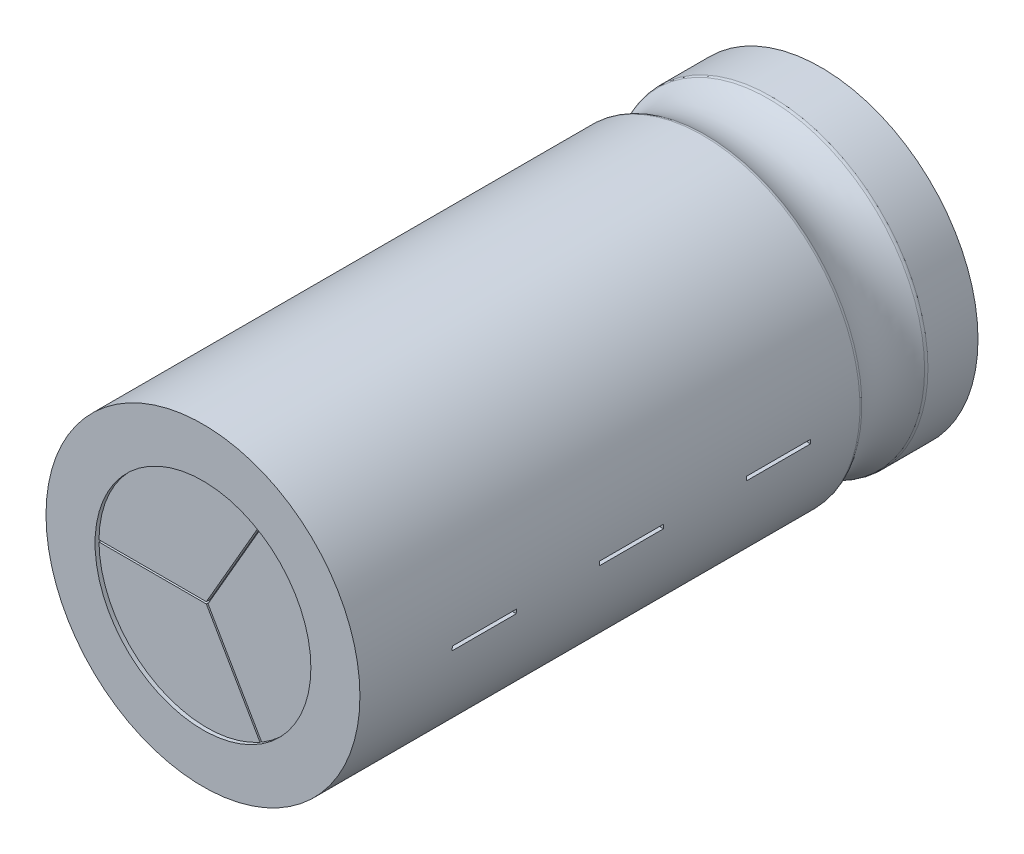
ISO-10303-21;
HEADER;
FILE_DESCRIPTION(('STEP AP214'),'2;1');
FILE_NAME('part.step','',(''),(''),'','','');
FILE_SCHEMA(('AUTOMOTIVE_DESIGN { 1 0 10303 214 1 1 1 1 }'));
ENDSEC;
DATA;
#1=APPLICATION_CONTEXT('core data for automotive mechanical design processes');
#2=APPLICATION_PROTOCOL_DEFINITION('international standard','automotive_design',2000,#1);
#3=PRODUCT_CONTEXT('',#1,'mechanical');
#4=PRODUCT('Part','Part','',(#3));
#5=PRODUCT_RELATED_PRODUCT_CATEGORY('part','',(#4));
#6=PRODUCT_DEFINITION_FORMATION('','',#4);
#7=PRODUCT_DEFINITION_CONTEXT('part definition',#1,'design');
#8=PRODUCT_DEFINITION('design','',#6,#7);
#9=PRODUCT_DEFINITION_SHAPE('','',#8);
#10=(LENGTH_UNIT() NAMED_UNIT(*) SI_UNIT(.MILLI.,.METRE.));
#11=(NAMED_UNIT(*) PLANE_ANGLE_UNIT() SI_UNIT($,.RADIAN.));
#12=(NAMED_UNIT(*) SI_UNIT($,.STERADIAN.) SOLID_ANGLE_UNIT());
#13=UNCERTAINTY_MEASURE_WITH_UNIT(LENGTH_MEASURE(1.E-05),#10,'distance_accuracy_value','');
#14=(GEOMETRIC_REPRESENTATION_CONTEXT(3) GLOBAL_UNCERTAINTY_ASSIGNED_CONTEXT((#13)) GLOBAL_UNIT_ASSIGNED_CONTEXT((#10,
#11,#12)) REPRESENTATION_CONTEXT('',''));
#15=CARTESIAN_POINT('',(0.,0.,0.));
#16=DIRECTION('',(0.,0.,1.));
#17=DIRECTION('',(1.,0.,0.));
#18=AXIS2_PLACEMENT_3D('',#15,#16,#17);
#19=CARTESIAN_POINT('',(0.,0.,0.));
#20=DIRECTION('',(0.,0.,1.));
#21=DIRECTION('',(1.,0.,0.));
#22=AXIS2_PLACEMENT_3D('',#19,#20,#21);
#23=PLANE('',#22);
#24=CARTESIAN_POINT('',(-3.50000000000006,0.,0.));
#25=DIRECTION('',(0.,0.,1.));
#26=DIRECTION('',(1.,0.,0.));
#27=AXIS2_PLACEMENT_3D('',#24,#25,#26);
#28=CIRCLE('',#27,0.6);
#29=CARTESIAN_POINT('',(-2.90000000000006,0.,0.));
#30=VERTEX_POINT('',#29);
#31=EDGE_CURVE('E96',#30,#30,#28,.F.);
#32=ORIENTED_EDGE('',*,*,#31,.F.);
#33=EDGE_LOOP('',(#32));
#34=FACE_BOUND('',#33,.T.);
#35=CARTESIAN_POINT('',(0.,0.,0.));
#36=DIRECTION('',(0.,0.,1.));
#37=DIRECTION('',(1.,0.,0.));
#38=AXIS2_PLACEMENT_3D('',#35,#36,#37);
#39=CIRCLE('',#38,8.);
#40=CARTESIAN_POINT('',(8.,0.,0.));
#41=VERTEX_POINT('',#40);
#42=EDGE_CURVE('E453',#41,#41,#39,.T.);
#43=ORIENTED_EDGE('',*,*,#42,.F.);
#44=EDGE_LOOP('',(#43));
#45=FACE_BOUND('',#44,.T.);
#46=CARTESIAN_POINT('',(3.50000000000006,0.,0.));
#47=DIRECTION('',(0.,0.,1.));
#48=DIRECTION('',(1.,0.,0.));
#49=AXIS2_PLACEMENT_3D('',#46,#47,#48);
#50=CIRCLE('',#49,0.6);
#51=CARTESIAN_POINT('',(4.10000000000006,0.,0.));
#52=VERTEX_POINT('',#51);
#53=EDGE_CURVE('E13',#52,#52,#50,.F.);
#54=ORIENTED_EDGE('',*,*,#53,.F.);
#55=EDGE_LOOP('',(#54));
#56=FACE_BOUND('',#55,.T.);
#57=ADVANCED_FACE('F88',(#34,#45,#56),#23,.F.);
#58=CARTESIAN_POINT('',(0.,0.,31.3));
#59=DIRECTION('',(0.,0.,1.));
#60=DIRECTION('',(1.,0.,0.));
#61=AXIS2_PLACEMENT_3D('',#58,#59,#60);
#62=PLANE('',#61);
#63=DIRECTION('',(-1.,0.,0.));
#64=VECTOR('',#63,1.);
#65=CARTESIAN_POINT('',(0.,0.0499999999999997,31.3));
#66=LINE('',#65,#64);
#67=CARTESIAN_POINT('',(-0.0288675134594828,0.0499999999999997,31.3));
#68=VERTEX_POINT('',#67);
#69=CARTESIAN_POINT('',(-5.49977272257682,0.049999999999999,31.3));
#70=VERTEX_POINT('',#69);
#71=EDGE_CURVE('E400',#68,#70,#66,.T.);
#72=ORIENTED_EDGE('',*,*,#71,.F.);
#73=DIRECTION('',(0.500000000000004,0.866025403784436,0.));
#74=VECTOR('',#73,1.);
#75=CARTESIAN_POINT('',(-5.34399220665468,-9.15606601717793,31.3));
#76=LINE('',#75,#74);
#77=CARTESIAN_POINT('',(2.70658509109921,4.78794289279222,31.3));
#78=VERTEX_POINT('',#77);
#79=EDGE_CURVE('E365',#68,#78,#76,.T.);
#80=ORIENTED_EDGE('',*,*,#79,.T.);
#81=CARTESIAN_POINT('',(0.,0.,31.3));
#82=DIRECTION('',(0.,0.,1.));
#83=DIRECTION('',(1.,0.,0.));
#84=AXIS2_PLACEMENT_3D('',#81,#82,#83);
#85=CIRCLE('',#84,5.5);
#86=EDGE_CURVE('E456',#78,#70,#85,.T.);
#87=ORIENTED_EDGE('',*,*,#86,.T.);
#88=EDGE_LOOP('',(#72,#80,#87));
#89=FACE_BOUND('',#88,.T.);
#90=ADVANCED_FACE('F498',(#89),#62,.T.);
#91=DIRECTION('',(0.499999999999992,-0.866025403784443,0.));
#92=VECTOR('',#91,1.);
#93=CARTESIAN_POINT('',(5.25738966627616,-9.20606601717808,31.3));
#94=LINE('',#93,#92);
#95=CARTESIAN_POINT('',(-0.0288675134594838,-0.049999999999998,31.3));
#96=VERTEX_POINT('',#95);
#97=CARTESIAN_POINT('',(2.70658509109914,-4.78794289279225,31.3));
#98=VERTEX_POINT('',#97);
#99=EDGE_CURVE('E419',#96,#98,#94,.T.);
#100=ORIENTED_EDGE('',*,*,#99,.F.);
#101=DIRECTION('',(-1.,0.,0.));
#102=VECTOR('',#101,1.);
#103=CARTESIAN_POINT('',(0.,-0.0499999999999997,31.3));
#104=LINE('',#103,#102);
#105=CARTESIAN_POINT('',(-5.49977272257682,-0.049999999999999,31.3));
#106=VERTEX_POINT('',#105);
#107=EDGE_CURVE('E410',#96,#106,#104,.T.);
#108=ORIENTED_EDGE('',*,*,#107,.T.);
#109=EDGE_CURVE('E464',#106,#98,#85,.T.);
#110=ORIENTED_EDGE('',*,*,#109,.T.);
#111=EDGE_LOOP('',(#100,#108,#110));
#112=FACE_BOUND('',#111,.T.);
#113=ADVANCED_FACE('F526',(#112),#62,.T.);
#114=DIRECTION('',(0.500000000000004,0.866025403784436,0.));
#115=VECTOR('',#114,1.);
#116=CARTESIAN_POINT('',(-5.25738966627624,-9.20606601717793,31.3));
#117=LINE('',#116,#115);
#118=CARTESIAN_POINT('',(0.0577350269189624,0.,31.3));
#119=VERTEX_POINT('',#118);
#120=CARTESIAN_POINT('',(2.79318763147765,4.73794289279222,31.3));
#121=VERTEX_POINT('',#120);
#122=EDGE_CURVE('E369',#119,#121,#117,.T.);
#123=ORIENTED_EDGE('',*,*,#122,.F.);
#124=DIRECTION('',(0.499999999999992,-0.866025403784443,0.));
#125=VECTOR('',#124,1.);
#126=CARTESIAN_POINT('',(5.3439922066546,-9.15606601717808,31.3));
#127=LINE('',#126,#125);
#128=CARTESIAN_POINT('',(2.79318763147759,-4.73794289279225,31.3));
#129=VERTEX_POINT('',#128);
#130=EDGE_CURVE('E427',#119,#129,#127,.T.);
#131=ORIENTED_EDGE('',*,*,#130,.T.);
#132=EDGE_CURVE('E448',#129,#121,#85,.T.);
#133=ORIENTED_EDGE('',*,*,#132,.T.);
#134=EDGE_LOOP('',(#123,#131,#133));
#135=FACE_BOUND('',#134,.T.);
#136=ADVANCED_FACE('F474',(#135),#62,.T.);
#137=CARTESIAN_POINT('',(0.,0.,31.5));
#138=DIRECTION('',(0.,0.,-1.));
#139=DIRECTION('',(-1.,0.,0.));
#140=AXIS2_PLACEMENT_3D('',#137,#138,#139);
#141=CYLINDRICAL_SURFACE('',#140,8.);
#142=CARTESIAN_POINT('',(0.,0.,11.7916666666667));
#143=DIRECTION('',(0.,0.,-1.));
#144=DIRECTION('',(0.998981413321726,-0.0451235618909506,0.));
#145=AXIS2_PLACEMENT_3D('',#142,#143,#144);
#146=CIRCLE('',#145,8.);
#147=CARTESIAN_POINT('',(7.99854122874935,-0.15276849150531,11.7916666666667));
#148=VERTEX_POINT('',#147);
#149=CARTESIAN_POINT('',(7.99185130657381,-0.360988495127605,11.7916666666667));
#150=VERTEX_POINT('',#149);
#151=EDGE_CURVE('E273',#148,#150,#146,.T.);
#152=ORIENTED_EDGE('',*,*,#151,.F.);
#153=DIRECTION('',(0.,0.,-1.));
#154=VECTOR('',#153,1.);
#155=CARTESIAN_POINT('',(7.99854122874935,-0.15276849150531,11.7916666666667));
#156=LINE('',#155,#154);
#157=CARTESIAN_POINT('',(7.99854122874935,-0.152768491505308,8.52777777777779));
#158=VERTEX_POINT('',#157);
#159=EDGE_CURVE('E103',#148,#158,#156,.T.);
#160=ORIENTED_EDGE('',*,*,#159,.T.);
#161=CARTESIAN_POINT('',(0.,0.,8.52777777777779));
#162=DIRECTION('',(0.,0.,-1.));
#163=DIRECTION('',(0.998981413321726,-0.0451235618909506,0.));
#164=AXIS2_PLACEMENT_3D('',#161,#162,#163);
#165=CIRCLE('',#164,8.);
#166=CARTESIAN_POINT('',(7.99185130657381,-0.360988495127605,8.52777777777779));
#167=VERTEX_POINT('',#166);
#168=EDGE_CURVE('E253',#158,#167,#165,.T.);
#169=ORIENTED_EDGE('',*,*,#168,.T.);
#170=DIRECTION('',(0.,0.,1.));
#171=VECTOR('',#170,1.);
#172=CARTESIAN_POINT('',(7.99185130657381,-0.360988495127605,8.52777777777779));
#173=LINE('',#172,#171);
#174=EDGE_CURVE('E237',#167,#150,#173,.T.);
#175=ORIENTED_EDGE('',*,*,#174,.T.);
#176=EDGE_LOOP('',(#152,#160,#169,#175));
#177=FACE_BOUND('',#176,.T.);
#178=CARTESIAN_POINT('',(0.,0.,19.2916666666667));
#179=DIRECTION('',(0.,0.,-1.));
#180=DIRECTION('',(0.998981413321726,-0.0451235618909506,0.));
#181=AXIS2_PLACEMENT_3D('',#178,#179,#180);
#182=CIRCLE('',#181,8.);
#183=CARTESIAN_POINT('',(7.99854122874935,-0.15276849150531,19.2916666666667));
#184=VERTEX_POINT('',#183);
#185=CARTESIAN_POINT('',(7.99185130657381,-0.360988495127605,19.2916666666667));
#186=VERTEX_POINT('',#185);
#187=EDGE_CURVE('E306',#184,#186,#182,.T.);
#188=ORIENTED_EDGE('',*,*,#187,.F.);
#189=DIRECTION('',(0.,0.,-1.));
#190=VECTOR('',#189,1.);
#191=CARTESIAN_POINT('',(7.99854122874935,-0.15276849150531,19.2916666666667));
#192=LINE('',#191,#190);
#193=CARTESIAN_POINT('',(7.99854122874935,-0.152768491505308,16.0277777777778));
#194=VERTEX_POINT('',#193);
#195=EDGE_CURVE('E111',#184,#194,#192,.T.);
#196=ORIENTED_EDGE('',*,*,#195,.T.);
#197=CARTESIAN_POINT('',(0.,0.,16.0277777777778));
#198=DIRECTION('',(0.,0.,-1.));
#199=DIRECTION('',(0.998981413321726,-0.0451235618909506,0.));
#200=AXIS2_PLACEMENT_3D('',#197,#198,#199);
#201=CIRCLE('',#200,8.);
#202=CARTESIAN_POINT('',(7.99185130657381,-0.360988495127605,16.0277777777778));
#203=VERTEX_POINT('',#202);
#204=EDGE_CURVE('E288',#194,#203,#201,.T.);
#205=ORIENTED_EDGE('',*,*,#204,.T.);
#206=DIRECTION('',(0.,0.,1.));
#207=VECTOR('',#206,1.);
#208=CARTESIAN_POINT('',(7.99185130657381,-0.360988495127605,16.0277777777778));
#209=LINE('',#208,#207);
#210=EDGE_CURVE('E281',#203,#186,#209,.T.);
#211=ORIENTED_EDGE('',*,*,#210,.T.);
#212=EDGE_LOOP('',(#188,#196,#205,#211));
#213=FACE_BOUND('',#212,.T.);
#214=CARTESIAN_POINT('',(0.,0.,26.7916666666667));
#215=DIRECTION('',(0.,0.,-1.));
#216=DIRECTION('',(0.998981413321726,-0.0451235618909506,0.));
#217=AXIS2_PLACEMENT_3D('',#214,#215,#216);
#218=CIRCLE('',#217,8.);
#219=CARTESIAN_POINT('',(7.99854122874935,-0.15276849150531,26.7916666666667));
#220=VERTEX_POINT('',#219);
#221=CARTESIAN_POINT('',(7.99185130657381,-0.360988495127605,26.7916666666667));
#222=VERTEX_POINT('',#221);
#223=EDGE_CURVE('E345',#220,#222,#218,.T.);
#224=ORIENTED_EDGE('',*,*,#223,.F.);
#225=DIRECTION('',(0.,0.,-1.));
#226=VECTOR('',#225,1.);
#227=CARTESIAN_POINT('',(7.99854122874935,-0.15276849150531,26.7916666666667));
#228=LINE('',#227,#226);
#229=CARTESIAN_POINT('',(7.99854122874935,-0.152768491505308,23.5277777777778));
#230=VERTEX_POINT('',#229);
#231=EDGE_CURVE('E341',#220,#230,#228,.T.);
#232=ORIENTED_EDGE('',*,*,#231,.T.);
#233=CARTESIAN_POINT('',(0.,0.,23.5277777777778));
#234=DIRECTION('',(0.,0.,-1.));
#235=DIRECTION('',(0.998981413321726,-0.0451235618909506,0.));
#236=AXIS2_PLACEMENT_3D('',#233,#234,#235);
#237=CIRCLE('',#236,8.);
#238=CARTESIAN_POINT('',(7.99185130657381,-0.360988495127605,23.5277777777778));
#239=VERTEX_POINT('',#238);
#240=EDGE_CURVE('E325',#230,#239,#237,.T.);
#241=ORIENTED_EDGE('',*,*,#240,.T.);
#242=DIRECTION('',(0.,0.,1.));
#243=VECTOR('',#242,1.);
#244=CARTESIAN_POINT('',(7.99185130657381,-0.360988495127605,23.5277777777778));
#245=LINE('',#244,#243);
#246=EDGE_CURVE('E318',#239,#222,#245,.T.);
#247=ORIENTED_EDGE('',*,*,#246,.T.);
#248=EDGE_LOOP('',(#224,#232,#241,#247));
#249=FACE_BOUND('',#248,.T.);
#250=CARTESIAN_POINT('',(0.,0.,6.01533319308667));
#251=DIRECTION('',(0.,0.,-1.));
#252=DIRECTION('',(-1.,0.,0.));
#253=AXIS2_PLACEMENT_3D('',#250,#251,#252);
#254=CIRCLE('',#253,8.);
#255=CARTESIAN_POINT('',(-8.,0.,6.01533319308667));
#256=VERTEX_POINT('',#255);
#257=EDGE_CURVE('E436',#256,#256,#254,.F.);
#258=ORIENTED_EDGE('',*,*,#257,.T.);
#259=EDGE_LOOP('',(#258));
#260=FACE_BOUND('',#259,.T.);
#261=CARTESIAN_POINT('',(0.,0.,31.5));
#262=DIRECTION('',(0.,0.,1.));
#263=DIRECTION('',(1.,0.,0.));
#264=AXIS2_PLACEMENT_3D('',#261,#262,#263);
#265=CIRCLE('',#264,8.);
#266=CARTESIAN_POINT('',(8.,0.,31.5));
#267=VERTEX_POINT('',#266);
#268=EDGE_CURVE('E450',#267,#267,#265,.T.);
#269=ORIENTED_EDGE('',*,*,#268,.F.);
#270=EDGE_LOOP('',(#269));
#271=FACE_BOUND('',#270,.T.);
#272=ADVANCED_FACE('F534',(#177,#213,#249,#260,#271),#141,.T.);
#273=CARTESIAN_POINT('',(0.,0.,31.5));
#274=DIRECTION('',(0.,0.,1.));
#275=DIRECTION('',(1.,0.,0.));
#276=AXIS2_PLACEMENT_3D('',#273,#274,#275);
#277=PLANE('',#276);
#278=CARTESIAN_POINT('',(0.,0.,31.5));
#279=DIRECTION('',(0.,0.,1.));
#280=DIRECTION('',(1.,0.,0.));
#281=AXIS2_PLACEMENT_3D('',#278,#279,#280);
#282=CIRCLE('',#281,5.5);
#283=CARTESIAN_POINT('',(5.5,0.,31.5));
#284=VERTEX_POINT('',#283);
#285=EDGE_CURVE('E445',#284,#284,#282,.T.);
#286=ORIENTED_EDGE('',*,*,#285,.F.);
#287=EDGE_LOOP('',(#286));
#288=FACE_BOUND('',#287,.T.);
#289=ORIENTED_EDGE('',*,*,#268,.T.);
#290=EDGE_LOOP('',(#289));
#291=FACE_BOUND('',#290,.T.);
#292=ADVANCED_FACE('F532',(#288,#291),#277,.T.);
#293=CARTESIAN_POINT('',(0.,0.,31.3));
#294=DIRECTION('',(0.,0.,1.));
#295=DIRECTION('',(1.,0.,0.));
#296=AXIS2_PLACEMENT_3D('',#293,#294,#295);
#297=CYLINDRICAL_SURFACE('',#296,5.5);
#298=ORIENTED_EDGE('',*,*,#86,.F.);
#299=DIRECTION('',(0.,0.,1.));
#300=VECTOR('',#299,1.);
#301=CARTESIAN_POINT('',(2.70658509109921,4.78794289279222,31.1));
#302=LINE('',#301,#300);
#303=CARTESIAN_POINT('',(2.70658509109921,4.78794289279222,31.1));
#304=VERTEX_POINT('',#303);
#305=EDGE_CURVE('E449',#304,#78,#302,.T.);
#306=ORIENTED_EDGE('',*,*,#305,.F.);
#307=CARTESIAN_POINT('',(0.,0.,31.1));
#308=DIRECTION('',(0.,0.,1.));
#309=DIRECTION('',(1.,0.,0.));
#310=AXIS2_PLACEMENT_3D('',#307,#308,#309);
#311=CIRCLE('',#310,5.5);
#312=CARTESIAN_POINT('',(2.79318763147765,4.73794289279222,31.1));
#313=VERTEX_POINT('',#312);
#314=EDGE_CURVE('E388',#313,#304,#311,.T.);
#315=ORIENTED_EDGE('',*,*,#314,.F.);
#316=DIRECTION('',(0.,0.,1.));
#317=VECTOR('',#316,1.);
#318=CARTESIAN_POINT('',(2.79318763147765,4.73794289279222,31.1));
#319=LINE('',#318,#317);
#320=EDGE_CURVE('E442',#313,#121,#319,.T.);
#321=ORIENTED_EDGE('',*,*,#320,.T.);
#322=ORIENTED_EDGE('',*,*,#132,.F.);
#323=DIRECTION('',(0.,0.,1.));
#324=VECTOR('',#323,1.);
#325=CARTESIAN_POINT('',(2.79318763147759,-4.73794289279225,31.1));
#326=LINE('',#325,#324);
#327=CARTESIAN_POINT('',(2.79318763147759,-4.73794289279225,31.1));
#328=VERTEX_POINT('',#327);
#329=EDGE_CURVE('E422',#328,#129,#326,.T.);
#330=ORIENTED_EDGE('',*,*,#329,.F.);
#331=CARTESIAN_POINT('',(0.,0.,31.1));
#332=DIRECTION('',(0.,0.,1.));
#333=DIRECTION('',(1.,0.,0.));
#334=AXIS2_PLACEMENT_3D('',#331,#332,#333);
#335=CIRCLE('',#334,5.5);
#336=CARTESIAN_POINT('',(2.70658509109914,-4.78794289279225,31.1));
#337=VERTEX_POINT('',#336);
#338=EDGE_CURVE('E380',#337,#328,#335,.T.);
#339=ORIENTED_EDGE('',*,*,#338,.F.);
#340=DIRECTION('',(0.,0.,1.));
#341=VECTOR('',#340,1.);
#342=CARTESIAN_POINT('',(2.70658509109914,-4.78794289279225,31.1));
#343=LINE('',#342,#341);
#344=EDGE_CURVE('E420',#337,#98,#343,.T.);
#345=ORIENTED_EDGE('',*,*,#344,.T.);
#346=ORIENTED_EDGE('',*,*,#109,.F.);
#347=DIRECTION('',(0.,0.,1.));
#348=VECTOR('',#347,1.);
#349=CARTESIAN_POINT('',(-5.49977272257682,-0.049999999999999,31.1));
#350=LINE('',#349,#348);
#351=CARTESIAN_POINT('',(-5.49977272257682,-0.049999999999999,31.1));
#352=VERTEX_POINT('',#351);
#353=EDGE_CURVE('E405',#352,#106,#350,.T.);
#354=ORIENTED_EDGE('',*,*,#353,.F.);
#355=CARTESIAN_POINT('',(0.,0.,31.1));
#356=DIRECTION('',(0.,0.,1.));
#357=DIRECTION('',(1.,0.,0.));
#358=AXIS2_PLACEMENT_3D('',#355,#356,#357);
#359=CIRCLE('',#358,5.5);
#360=CARTESIAN_POINT('',(-5.49977272257682,0.049999999999999,31.1));
#361=VERTEX_POINT('',#360);
#362=EDGE_CURVE('E372',#361,#352,#359,.T.);
#363=ORIENTED_EDGE('',*,*,#362,.F.);
#364=DIRECTION('',(0.,0.,1.));
#365=VECTOR('',#364,1.);
#366=CARTESIAN_POINT('',(-5.49977272257682,0.049999999999999,31.1));
#367=LINE('',#366,#365);
#368=EDGE_CURVE('E403',#361,#70,#367,.T.);
#369=ORIENTED_EDGE('',*,*,#368,.T.);
#370=EDGE_LOOP('',(#298,#306,#315,#321,#322,#330,#339,#345,#346,#354,#363,#369));
#371=FACE_BOUND('',#370,.T.);
#372=ORIENTED_EDGE('',*,*,#285,.T.);
#373=EDGE_LOOP('',(#372));
#374=FACE_BOUND('',#373,.T.);
#375=ADVANCED_FACE('F479',(#371,#374),#297,.F.);
#376=CARTESIAN_POINT('',(-5.34399220665468,-9.15606601717793,31.1));
#377=DIRECTION('',(0.866025403784436,-0.500000000000004,0.));
#378=DIRECTION('',(0.500000000000004,0.866025403784436,0.));
#379=AXIS2_PLACEMENT_3D('',#376,#377,#378);
#380=PLANE('',#379);
#381=ORIENTED_EDGE('',*,*,#79,.F.);
#382=DIRECTION('',(0.,0.,1.));
#383=VECTOR('',#382,1.);
#384=CARTESIAN_POINT('',(-0.0288675134594828,0.0499999999999997,31.1));
#385=LINE('',#384,#383);
#386=CARTESIAN_POINT('',(-0.0288675134594828,0.0499999999999997,31.1));
#387=VERTEX_POINT('',#386);
#388=EDGE_CURVE('E391',#387,#68,#385,.T.);
#389=ORIENTED_EDGE('',*,*,#388,.F.);
#390=DIRECTION('',(0.500000000000004,0.866025403784436,0.));
#391=VECTOR('',#390,1.);
#392=CARTESIAN_POINT('',(-5.34399220665468,-9.15606601717793,31.1));
#393=LINE('',#392,#391);
#394=EDGE_CURVE('E366',#387,#304,#393,.T.);
#395=ORIENTED_EDGE('',*,*,#394,.T.);
#396=ORIENTED_EDGE('',*,*,#305,.T.);
#397=EDGE_LOOP('',(#381,#389,#395,#396));
#398=FACE_BOUND('',#397,.T.);
#399=ADVANCED_FACE('F494',(#398),#380,.T.);
#400=CARTESIAN_POINT('',(-5.25738966627624,-9.20606601717793,31.1));
#401=DIRECTION('',(0.866025403784436,-0.500000000000004,0.));
#402=DIRECTION('',(0.500000000000004,0.866025403784436,0.));
#403=AXIS2_PLACEMENT_3D('',#400,#401,#402);
#404=PLANE('',#403);
#405=ORIENTED_EDGE('',*,*,#122,.T.);
#406=ORIENTED_EDGE('',*,*,#320,.F.);
#407=DIRECTION('',(0.500000000000004,0.866025403784436,0.));
#408=VECTOR('',#407,1.);
#409=CARTESIAN_POINT('',(-5.25738966627624,-9.20606601717793,31.1));
#410=LINE('',#409,#408);
#411=CARTESIAN_POINT('',(0.0577350269189624,0.,31.1));
#412=VERTEX_POINT('',#411);
#413=EDGE_CURVE('E385',#412,#313,#410,.T.);
#414=ORIENTED_EDGE('',*,*,#413,.F.);
#415=DIRECTION('',(0.,0.,1.));
#416=VECTOR('',#415,1.);
#417=CARTESIAN_POINT('',(0.0577350269189624,0.,31.1));
#418=LINE('',#417,#416);
#419=EDGE_CURVE('E431',#412,#119,#418,.T.);
#420=ORIENTED_EDGE('',*,*,#419,.T.);
#421=EDGE_LOOP('',(#405,#406,#414,#420));
#422=FACE_BOUND('',#421,.T.);
#423=ADVANCED_FACE('F486',(#422),#404,.F.);
#424=CARTESIAN_POINT('',(5.3439922066546,-9.15606601717808,31.1));
#425=DIRECTION('',(-0.866025403784443,-0.499999999999992,0.));
#426=DIRECTION('',(0.499999999999992,-0.866025403784443,0.));
#427=AXIS2_PLACEMENT_3D('',#424,#425,#426);
#428=PLANE('',#427);
#429=ORIENTED_EDGE('',*,*,#130,.F.);
#430=ORIENTED_EDGE('',*,*,#419,.F.);
#431=DIRECTION('',(0.499999999999992,-0.866025403784443,0.));
#432=VECTOR('',#431,1.);
#433=CARTESIAN_POINT('',(5.3439922066546,-9.15606601717808,31.1));
#434=LINE('',#433,#432);
#435=EDGE_CURVE('E383',#412,#328,#434,.T.);
#436=ORIENTED_EDGE('',*,*,#435,.T.);
#437=ORIENTED_EDGE('',*,*,#329,.T.);
#438=EDGE_LOOP('',(#429,#430,#436,#437));
#439=FACE_BOUND('',#438,.T.);
#440=ADVANCED_FACE('F508',(#439),#428,.T.);
#441=CARTESIAN_POINT('',(5.25738966627616,-9.20606601717808,31.1));
#442=DIRECTION('',(-0.866025403784443,-0.499999999999992,0.));
#443=DIRECTION('',(0.499999999999992,-0.866025403784443,0.));
#444=AXIS2_PLACEMENT_3D('',#441,#442,#443);
#445=PLANE('',#444);
#446=ORIENTED_EDGE('',*,*,#99,.T.);
#447=ORIENTED_EDGE('',*,*,#344,.F.);
#448=DIRECTION('',(0.499999999999992,-0.866025403784443,0.));
#449=VECTOR('',#448,1.);
#450=CARTESIAN_POINT('',(5.25738966627616,-9.20606601717808,31.1));
#451=LINE('',#450,#449);
#452=CARTESIAN_POINT('',(-0.0288675134594838,-0.049999999999998,31.1));
#453=VERTEX_POINT('',#452);
#454=EDGE_CURVE('E377',#453,#337,#451,.T.);
#455=ORIENTED_EDGE('',*,*,#454,.F.);
#456=DIRECTION('',(0.,0.,1.));
#457=VECTOR('',#456,1.);
#458=CARTESIAN_POINT('',(-0.0288675134594838,-0.049999999999998,31.1));
#459=LINE('',#458,#457);
#460=EDGE_CURVE('E414',#453,#96,#459,.T.);
#461=ORIENTED_EDGE('',*,*,#460,.T.);
#462=EDGE_LOOP('',(#446,#447,#455,#461));
#463=FACE_BOUND('',#462,.T.);
#464=ADVANCED_FACE('F510',(#463),#445,.F.);
#465=CARTESIAN_POINT('',(0.,-0.0499999999999997,31.1));
#466=DIRECTION('',(0.,1.,0.));
#467=DIRECTION('',(-1.,0.,0.));
#468=AXIS2_PLACEMENT_3D('',#465,#466,#467);
#469=PLANE('',#468);
#470=ORIENTED_EDGE('',*,*,#107,.F.);
#471=ORIENTED_EDGE('',*,*,#460,.F.);
#472=DIRECTION('',(-1.,0.,0.));
#473=VECTOR('',#472,1.);
#474=CARTESIAN_POINT('',(0.,-0.0499999999999997,31.1));
#475=LINE('',#474,#473);
#476=EDGE_CURVE('E375',#453,#352,#475,.T.);
#477=ORIENTED_EDGE('',*,*,#476,.T.);
#478=ORIENTED_EDGE('',*,*,#353,.T.);
#479=EDGE_LOOP('',(#470,#471,#477,#478));
#480=FACE_BOUND('',#479,.T.);
#481=ADVANCED_FACE('F516',(#480),#469,.T.);
#482=CARTESIAN_POINT('',(0.,0.0499999999999997,31.1));
#483=DIRECTION('',(0.,1.,0.));
#484=DIRECTION('',(-1.,0.,0.));
#485=AXIS2_PLACEMENT_3D('',#482,#483,#484);
#486=PLANE('',#485);
#487=ORIENTED_EDGE('',*,*,#71,.T.);
#488=ORIENTED_EDGE('',*,*,#368,.F.);
#489=DIRECTION('',(-1.,0.,0.));
#490=VECTOR('',#489,1.);
#491=CARTESIAN_POINT('',(0.,0.0499999999999997,31.1));
#492=LINE('',#491,#490);
#493=EDGE_CURVE('E368',#387,#361,#492,.T.);
#494=ORIENTED_EDGE('',*,*,#493,.F.);
#495=ORIENTED_EDGE('',*,*,#388,.T.);
#496=EDGE_LOOP('',(#487,#488,#494,#495));
#497=FACE_BOUND('',#496,.T.);
#498=ADVANCED_FACE('F503',(#497),#486,.F.);
#499=CARTESIAN_POINT('',(0.,-12.2414213562373,31.1));
#500=DIRECTION('',(0.,0.,1.));
#501=DIRECTION('',(1.,0.,0.));
#502=AXIS2_PLACEMENT_3D('',#499,#500,#501);
#503=PLANE('',#502);
#504=ORIENTED_EDGE('',*,*,#394,.F.);
#505=ORIENTED_EDGE('',*,*,#493,.T.);
#506=ORIENTED_EDGE('',*,*,#362,.T.);
#507=ORIENTED_EDGE('',*,*,#476,.F.);
#508=ORIENTED_EDGE('',*,*,#454,.T.);
#509=ORIENTED_EDGE('',*,*,#338,.T.);
#510=ORIENTED_EDGE('',*,*,#435,.F.);
#511=ORIENTED_EDGE('',*,*,#413,.T.);
#512=ORIENTED_EDGE('',*,*,#314,.T.);
#513=EDGE_LOOP('',(#504,#505,#506,#507,#508,#509,#510,#511,#512));
#514=FACE_BOUND('',#513,.T.);
#515=ADVANCED_FACE('F505',(#514),#503,.T.);
#516=CARTESIAN_POINT('',(0.,0.,4.2832823855178));
#517=DIRECTION('',(0.,0.,-1.));
#518=DIRECTION('',(-1.,0.,0.));
#519=AXIS2_PLACEMENT_3D('',#516,#517,#518);
#520=TOROIDAL_SURFACE('',#519,10.5,3.);
#521=CARTESIAN_POINT('',(0.,0.,5.88209851558138));
#522=DIRECTION('',(0.,0.,-1.));
#523=DIRECTION('',(-1.,0.,0.));
#524=AXIS2_PLACEMENT_3D('',#521,#522,#523);
#525=CIRCLE('',#524,7.96153846153846);
#526=CARTESIAN_POINT('',(-7.96153846153846,0.,5.88209851558138));
#527=VERTEX_POINT('',#526);
#528=EDGE_CURVE('E552',#527,#527,#525,.T.);
#529=ORIENTED_EDGE('',*,*,#528,.T.);
#530=EDGE_LOOP('',(#529));
#531=FACE_BOUND('',#530,.T.);
#532=CARTESIAN_POINT('',(0.,0.,2.68446625545421));
#533=DIRECTION('',(0.,0.,1.));
#534=DIRECTION('',(1.,0.,0.));
#535=AXIS2_PLACEMENT_3D('',#532,#533,#534);
#536=CIRCLE('',#535,7.96153846153846);
#537=CARTESIAN_POINT('',(7.96153846153846,0.,2.68446625545421));
#538=VERTEX_POINT('',#537);
#539=EDGE_CURVE('E556',#538,#538,#536,.T.);
#540=ORIENTED_EDGE('',*,*,#539,.T.);
#541=EDGE_LOOP('',(#540));
#542=FACE_BOUND('',#541,.T.);
#543=ADVANCED_FACE('F547',(#531,#542),#520,.F.);
#544=CARTESIAN_POINT('',(0.,0.,2.55123157794892));
#545=DIRECTION('',(0.,0.,1.));
#546=DIRECTION('',(1.,0.,0.));
#547=AXIS2_PLACEMENT_3D('',#544,#545,#546);
#548=CIRCLE('',#547,8.);
#549=CARTESIAN_POINT('',(8.,0.,2.55123157794892));
#550=VERTEX_POINT('',#549);
#551=EDGE_CURVE('E560',#550,#550,#548,.F.);
#552=ORIENTED_EDGE('',*,*,#551,.T.);
#553=EDGE_LOOP('',(#552));
#554=FACE_BOUND('',#553,.T.);
#555=ORIENTED_EDGE('',*,*,#42,.T.);
#556=EDGE_LOOP('',(#555));
#557=FACE_BOUND('',#556,.T.);
#558=ADVANCED_FACE('F537',(#554,#557),#141,.T.);
#559=CARTESIAN_POINT('',(0.,0.,6.01533319308667));
#560=DIRECTION('',(0.,0.,-1.));
#561=DIRECTION('',(-1.,0.,0.));
#562=AXIS2_PLACEMENT_3D('',#559,#560,#561);
#563=TOROIDAL_SURFACE('',#562,7.75,0.25);
#564=ORIENTED_EDGE('',*,*,#528,.F.);
#565=EDGE_LOOP('',(#564));
#566=FACE_BOUND('',#565,.T.);
#567=ORIENTED_EDGE('',*,*,#257,.F.);
#568=EDGE_LOOP('',(#567));
#569=FACE_BOUND('',#568,.T.);
#570=ADVANCED_FACE('F538',(#566,#569),#563,.T.);
#571=CARTESIAN_POINT('',(0.,0.,2.55123157794892));
#572=DIRECTION('',(0.,0.,1.));
#573=DIRECTION('',(1.,0.,0.));
#574=AXIS2_PLACEMENT_3D('',#571,#572,#573);
#575=TOROIDAL_SURFACE('',#574,7.75,0.25);
#576=ORIENTED_EDGE('',*,*,#539,.F.);
#577=EDGE_LOOP('',(#576));
#578=FACE_BOUND('',#577,.T.);
#579=ORIENTED_EDGE('',*,*,#551,.F.);
#580=EDGE_LOOP('',(#579));
#581=FACE_BOUND('',#580,.T.);
#582=ADVANCED_FACE('F90',(#578,#581),#575,.T.);
#583=CARTESIAN_POINT('',(-3.50000000000006,0.,-2.));
#584=DIRECTION('',(0.,0.,1.));
#585=DIRECTION('',(1.,0.,0.));
#586=AXIS2_PLACEMENT_3D('',#583,#584,#585);
#587=CYLINDRICAL_SURFACE('',#586,0.6);
#588=CARTESIAN_POINT('',(-3.50000000000006,0.,-2.));
#589=DIRECTION('',(0.,0.,-1.));
#590=DIRECTION('',(-1.,0.,0.));
#591=AXIS2_PLACEMENT_3D('',#588,#589,#590);
#592=CIRCLE('',#591,0.6);
#593=CARTESIAN_POINT('',(-4.10000000000006,0.,-2.));
#594=VERTEX_POINT('',#593);
#595=EDGE_CURVE('E362',#594,#594,#592,.T.);
#596=ORIENTED_EDGE('',*,*,#595,.F.);
#597=EDGE_LOOP('',(#596));
#598=FACE_BOUND('',#597,.T.);
#599=ORIENTED_EDGE('',*,*,#31,.T.);
#600=EDGE_LOOP('',(#599));
#601=FACE_BOUND('',#600,.T.);
#602=ADVANCED_FACE('F545',(#598,#601),#587,.T.);
#603=CARTESIAN_POINT('',(-3.50000000000006,0.,-2.));
#604=DIRECTION('',(0.,0.,-1.));
#605=DIRECTION('',(-1.,0.,0.));
#606=AXIS2_PLACEMENT_3D('',#603,#604,#605);
#607=PLANE('',#606);
#608=ORIENTED_EDGE('',*,*,#595,.T.);
#609=EDGE_LOOP('',(#608));
#610=FACE_BOUND('',#609,.T.);
#611=ADVANCED_FACE('F567',(#610),#607,.T.);
#612=CARTESIAN_POINT('',(3.50000000000006,0.,-2.));
#613=DIRECTION('',(0.,0.,1.));
#614=DIRECTION('',(1.,0.,0.));
#615=AXIS2_PLACEMENT_3D('',#612,#613,#614);
#616=CYLINDRICAL_SURFACE('',#615,0.6);
#617=CARTESIAN_POINT('',(3.50000000000006,0.,-2.));
#618=DIRECTION('',(0.,0.,-1.));
#619=DIRECTION('',(1.,0.,0.));
#620=AXIS2_PLACEMENT_3D('',#617,#618,#619);
#621=CIRCLE('',#620,0.6);
#622=CARTESIAN_POINT('',(4.10000000000006,0.,-2.));
#623=VERTEX_POINT('',#622);
#624=EDGE_CURVE('E358',#623,#623,#621,.T.);
#625=ORIENTED_EDGE('',*,*,#624,.F.);
#626=EDGE_LOOP('',(#625));
#627=FACE_BOUND('',#626,.T.);
#628=ORIENTED_EDGE('',*,*,#53,.T.);
#629=EDGE_LOOP('',(#628));
#630=FACE_BOUND('',#629,.T.);
#631=ADVANCED_FACE('F573',(#627,#630),#616,.T.);
#632=CARTESIAN_POINT('',(3.50000000000006,0.,-2.));
#633=DIRECTION('',(0.,0.,1.));
#634=DIRECTION('',(1.,0.,0.));
#635=AXIS2_PLACEMENT_3D('',#632,#633,#634);
#636=PLANE('',#635);
#637=ORIENTED_EDGE('',*,*,#624,.T.);
#638=EDGE_LOOP('',(#637));
#639=FACE_BOUND('',#638,.T.);
#640=ADVANCED_FACE('F742',(#639),#636,.F.);
#641=CARTESIAN_POINT('',(7.99854122874935,-0.15276849150531,25.1597222222222));
#642=DIRECTION('',(-0.0190960614381637,-0.999817653593669,0.));
#643=DIRECTION('',(0.,0.,-1.));
#644=AXIS2_PLACEMENT_3D('',#641,#642,#643);
#645=PLANE('',#644);
#646=DIRECTION('',(-0.999817653593669,0.0190960614381637,0.));
#647=VECTOR('',#646,1.);
#648=CARTESIAN_POINT('',(7.99854122874935,-0.15276849150531,26.7916666666667));
#649=LINE('',#648,#647);
#650=CARTESIAN_POINT('',(6.99872357515568,-0.133672430067145,26.7916666666667));
#651=VERTEX_POINT('',#650);
#652=EDGE_CURVE('E356',#220,#651,#649,.T.);
#653=ORIENTED_EDGE('',*,*,#652,.T.);
#654=DIRECTION('',(0.,0.,-1.));
#655=VECTOR('',#654,1.);
#656=CARTESIAN_POINT('',(6.99872357515568,-0.133672430067145,31.5));
#657=LINE('',#656,#655);
#658=CARTESIAN_POINT('',(6.99872357515568,-0.133672430067141,23.5277777777778));
#659=VERTEX_POINT('',#658);
#660=EDGE_CURVE('E331',#651,#659,#657,.T.);
#661=ORIENTED_EDGE('',*,*,#660,.T.);
#662=DIRECTION('',(-0.999817653593669,0.0190960614381635,0.));
#663=VECTOR('',#662,1.);
#664=CARTESIAN_POINT('',(7.99854122874935,-0.152768491505308,23.5277777777778));
#665=LINE('',#664,#663);
#666=EDGE_CURVE('E354',#230,#659,#665,.T.);
#667=ORIENTED_EDGE('',*,*,#666,.F.);
#668=ORIENTED_EDGE('',*,*,#231,.F.);
#669=EDGE_LOOP('',(#653,#661,#667,#668));
#670=FACE_BOUND('',#669,.T.);
#671=ADVANCED_FACE('F750',(#670),#645,.T.);
#672=CARTESIAN_POINT('',(0.,0.,23.5277777777778));
#673=DIRECTION('',(0.,0.,1.));
#674=DIRECTION('',(1.,0.,0.));
#675=AXIS2_PLACEMENT_3D('',#672,#673,#674);
#676=PLANE('',#675);
#677=ORIENTED_EDGE('',*,*,#666,.T.);
#678=CARTESIAN_POINT('',(0.,0.,23.5277777777778));
#679=DIRECTION('',(0.,0.,-1.));
#680=DIRECTION('',(-1.,0.,0.));
#681=AXIS2_PLACEMENT_3D('',#678,#679,#680);
#682=CIRCLE('',#681,7.);
#683=CARTESIAN_POINT('',(6.99286989325208,-0.315864933236653,23.5277777777778));
#684=VERTEX_POINT('',#683);
#685=EDGE_CURVE('E326',#659,#684,#682,.T.);
#686=ORIENTED_EDGE('',*,*,#685,.T.);
#687=DIRECTION('',(-0.998981413321726,0.0451235618909506,0.));
#688=VECTOR('',#687,1.);
#689=CARTESIAN_POINT('',(7.99185130657381,-0.360988495127605,23.5277777777778));
#690=LINE('',#689,#688);
#691=EDGE_CURVE('E352',#239,#684,#690,.T.);
#692=ORIENTED_EDGE('',*,*,#691,.F.);
#693=ORIENTED_EDGE('',*,*,#240,.F.);
#694=EDGE_LOOP('',(#677,#686,#692,#693));
#695=FACE_BOUND('',#694,.T.);
#696=ADVANCED_FACE('F759',(#695),#676,.T.);
#697=CARTESIAN_POINT('',(7.99185130657381,-0.360988495127605,25.1597222222222));
#698=DIRECTION('',(0.0451235618909506,0.998981413321726,0.));
#699=DIRECTION('',(0.,0.,1.));
#700=AXIS2_PLACEMENT_3D('',#697,#698,#699);
#701=PLANE('',#700);
#702=ORIENTED_EDGE('',*,*,#691,.T.);
#703=DIRECTION('',(0.,0.,-1.));
#704=VECTOR('',#703,1.);
#705=CARTESIAN_POINT('',(6.99286989325208,-0.315864933236653,31.5));
#706=LINE('',#705,#704);
#707=CARTESIAN_POINT('',(6.99286989325208,-0.315864933236653,26.7916666666667));
#708=VERTEX_POINT('',#707);
#709=EDGE_CURVE('E320',#684,#708,#706,.F.);
#710=ORIENTED_EDGE('',*,*,#709,.T.);
#711=DIRECTION('',(-0.998981413321726,0.0451235618909506,0.));
#712=VECTOR('',#711,1.);
#713=CARTESIAN_POINT('',(7.99185130657381,-0.360988495127605,26.7916666666667));
#714=LINE('',#713,#712);
#715=EDGE_CURVE('E330',#222,#708,#714,.T.);
#716=ORIENTED_EDGE('',*,*,#715,.F.);
#717=ORIENTED_EDGE('',*,*,#246,.F.);
#718=EDGE_LOOP('',(#702,#710,#716,#717));
#719=FACE_BOUND('',#718,.T.);
#720=ADVANCED_FACE('F768',(#719),#701,.T.);
#721=CARTESIAN_POINT('',(0.,0.,26.7916666666667));
#722=DIRECTION('',(0.,0.,1.));
#723=DIRECTION('',(1.,0.,0.));
#724=AXIS2_PLACEMENT_3D('',#721,#722,#723);
#725=PLANE('',#724);
#726=ORIENTED_EDGE('',*,*,#223,.T.);
#727=ORIENTED_EDGE('',*,*,#715,.T.);
#728=CARTESIAN_POINT('',(0.,0.,26.7916666666667));
#729=DIRECTION('',(0.,0.,-1.));
#730=DIRECTION('',(-1.,0.,0.));
#731=AXIS2_PLACEMENT_3D('',#728,#729,#730);
#732=CIRCLE('',#731,7.);
#733=EDGE_CURVE('E324',#651,#708,#732,.T.);
#734=ORIENTED_EDGE('',*,*,#733,.F.);
#735=ORIENTED_EDGE('',*,*,#652,.F.);
#736=EDGE_LOOP('',(#726,#727,#734,#735));
#737=FACE_BOUND('',#736,.T.);
#738=ADVANCED_FACE('F777',(#737),#725,.F.);
#739=CARTESIAN_POINT('',(0.,0.,31.5));
#740=DIRECTION('',(0.,0.,-1.));
#741=DIRECTION('',(-1.,0.,0.));
#742=AXIS2_PLACEMENT_3D('',#739,#740,#741);
#743=CYLINDRICAL_SURFACE('',#742,7.);
#744=ORIENTED_EDGE('',*,*,#709,.F.);
#745=ORIENTED_EDGE('',*,*,#685,.F.);
#746=ORIENTED_EDGE('',*,*,#660,.F.);
#747=ORIENTED_EDGE('',*,*,#733,.T.);
#748=EDGE_LOOP('',(#744,#745,#746,#747));
#749=FACE_BOUND('',#748,.T.);
#750=ADVANCED_FACE('F786',(#749),#743,.T.);
#751=CARTESIAN_POINT('',(7.99854122874935,-0.15276849150531,17.6597222222222));
#752=DIRECTION('',(-0.0190960614381637,-0.999817653593669,0.));
#753=DIRECTION('',(0.,0.,-1.));
#754=AXIS2_PLACEMENT_3D('',#751,#752,#753);
#755=PLANE('',#754);
#756=DIRECTION('',(-0.999817653593669,0.0190960614381637,0.));
#757=VECTOR('',#756,1.);
#758=CARTESIAN_POINT('',(7.99854122874935,-0.15276849150531,19.2916666666667));
#759=LINE('',#758,#757);
#760=CARTESIAN_POINT('',(6.99872357515568,-0.133672430067145,19.2916666666667));
#761=VERTEX_POINT('',#760);
#762=EDGE_CURVE('E316',#184,#761,#759,.T.);
#763=ORIENTED_EDGE('',*,*,#762,.T.);
#764=DIRECTION('',(0.,0.,-1.));
#765=VECTOR('',#764,1.);
#766=CARTESIAN_POINT('',(6.99872357515568,-0.133672430067145,31.5));
#767=LINE('',#766,#765);
#768=CARTESIAN_POINT('',(6.99872357515568,-0.133672430067141,16.0277777777778));
#769=VERTEX_POINT('',#768);
#770=EDGE_CURVE('E294',#761,#769,#767,.T.);
#771=ORIENTED_EDGE('',*,*,#770,.T.);
#772=DIRECTION('',(-0.999817653593669,0.0190960614381635,0.));
#773=VECTOR('',#772,1.);
#774=CARTESIAN_POINT('',(7.99854122874935,-0.152768491505308,16.0277777777778));
#775=LINE('',#774,#773);
#776=EDGE_CURVE('E314',#194,#769,#775,.T.);
#777=ORIENTED_EDGE('',*,*,#776,.F.);
#778=ORIENTED_EDGE('',*,*,#195,.F.);
#779=EDGE_LOOP('',(#763,#771,#777,#778));
#780=FACE_BOUND('',#779,.T.);
#781=ADVANCED_FACE('F795',(#780),#755,.T.);
#782=CARTESIAN_POINT('',(0.,0.,16.0277777777778));
#783=DIRECTION('',(0.,0.,1.));
#784=DIRECTION('',(1.,0.,0.));
#785=AXIS2_PLACEMENT_3D('',#782,#783,#784);
#786=PLANE('',#785);
#787=ORIENTED_EDGE('',*,*,#776,.T.);
#788=CARTESIAN_POINT('',(0.,0.,16.0277777777778));
#789=DIRECTION('',(0.,0.,-1.));
#790=DIRECTION('',(-1.,0.,0.));
#791=AXIS2_PLACEMENT_3D('',#788,#789,#790);
#792=CIRCLE('',#791,7.);
#793=CARTESIAN_POINT('',(6.99286989325208,-0.315864933236653,16.0277777777778));
#794=VERTEX_POINT('',#793);
#795=EDGE_CURVE('E289',#769,#794,#792,.T.);
#796=ORIENTED_EDGE('',*,*,#795,.T.);
#797=DIRECTION('',(-0.998981413321726,0.0451235618909506,0.));
#798=VECTOR('',#797,1.);
#799=CARTESIAN_POINT('',(7.99185130657381,-0.360988495127605,16.0277777777778));
#800=LINE('',#799,#798);
#801=EDGE_CURVE('E312',#203,#794,#800,.T.);
#802=ORIENTED_EDGE('',*,*,#801,.F.);
#803=ORIENTED_EDGE('',*,*,#204,.F.);
#804=EDGE_LOOP('',(#787,#796,#802,#803));
#805=FACE_BOUND('',#804,.T.);
#806=ADVANCED_FACE('F804',(#805),#786,.T.);
#807=CARTESIAN_POINT('',(7.99185130657381,-0.360988495127605,17.6597222222222));
#808=DIRECTION('',(0.0451235618909506,0.998981413321726,0.));
#809=DIRECTION('',(0.,0.,1.));
#810=AXIS2_PLACEMENT_3D('',#807,#808,#809);
#811=PLANE('',#810);
#812=ORIENTED_EDGE('',*,*,#801,.T.);
#813=DIRECTION('',(0.,0.,-1.));
#814=VECTOR('',#813,1.);
#815=CARTESIAN_POINT('',(6.99286989325208,-0.315864933236653,31.5));
#816=LINE('',#815,#814);
#817=CARTESIAN_POINT('',(6.99286989325208,-0.315864933236653,19.2916666666667));
#818=VERTEX_POINT('',#817);
#819=EDGE_CURVE('E283',#794,#818,#816,.F.);
#820=ORIENTED_EDGE('',*,*,#819,.T.);
#821=DIRECTION('',(-0.998981413321726,0.0451235618909506,0.));
#822=VECTOR('',#821,1.);
#823=CARTESIAN_POINT('',(7.99185130657381,-0.360988495127605,19.2916666666667));
#824=LINE('',#823,#822);
#825=EDGE_CURVE('E293',#186,#818,#824,.T.);
#826=ORIENTED_EDGE('',*,*,#825,.F.);
#827=ORIENTED_EDGE('',*,*,#210,.F.);
#828=EDGE_LOOP('',(#812,#820,#826,#827));
#829=FACE_BOUND('',#828,.T.);
#830=ADVANCED_FACE('F812',(#829),#811,.T.);
#831=CARTESIAN_POINT('',(0.,0.,19.2916666666667));
#832=DIRECTION('',(0.,0.,1.));
#833=DIRECTION('',(1.,0.,0.));
#834=AXIS2_PLACEMENT_3D('',#831,#832,#833);
#835=PLANE('',#834);
#836=ORIENTED_EDGE('',*,*,#187,.T.);
#837=ORIENTED_EDGE('',*,*,#825,.T.);
#838=CARTESIAN_POINT('',(0.,0.,19.2916666666667));
#839=DIRECTION('',(0.,0.,-1.));
#840=DIRECTION('',(-1.,0.,0.));
#841=AXIS2_PLACEMENT_3D('',#838,#839,#840);
#842=CIRCLE('',#841,7.);
#843=EDGE_CURVE('E287',#761,#818,#842,.T.);
#844=ORIENTED_EDGE('',*,*,#843,.F.);
#845=ORIENTED_EDGE('',*,*,#762,.F.);
#846=EDGE_LOOP('',(#836,#837,#844,#845));
#847=FACE_BOUND('',#846,.T.);
#848=ADVANCED_FACE('F821',(#847),#835,.F.);
#849=CARTESIAN_POINT('',(0.,0.,31.5));
#850=DIRECTION('',(0.,0.,-1.));
#851=DIRECTION('',(-1.,0.,0.));
#852=AXIS2_PLACEMENT_3D('',#849,#850,#851);
#853=CYLINDRICAL_SURFACE('',#852,7.);
#854=ORIENTED_EDGE('',*,*,#819,.F.);
#855=ORIENTED_EDGE('',*,*,#795,.F.);
#856=ORIENTED_EDGE('',*,*,#770,.F.);
#857=ORIENTED_EDGE('',*,*,#843,.T.);
#858=EDGE_LOOP('',(#854,#855,#856,#857));
#859=FACE_BOUND('',#858,.T.);
#860=ADVANCED_FACE('F830',(#859),#853,.T.);
#861=CARTESIAN_POINT('',(7.99854122874935,-0.15276849150531,10.1597222222222));
#862=DIRECTION('',(-0.0190960614381637,-0.999817653593669,0.));
#863=DIRECTION('',(0.,0.,-1.));
#864=AXIS2_PLACEMENT_3D('',#861,#862,#863);
#865=PLANE('',#864);
#866=DIRECTION('',(-0.999817653593669,0.0190960614381637,0.));
#867=VECTOR('',#866,1.);
#868=CARTESIAN_POINT('',(7.99854122874935,-0.15276849150531,11.7916666666667));
#869=LINE('',#868,#867);
#870=CARTESIAN_POINT('',(6.99872357515568,-0.133672430067145,11.7916666666667));
#871=VERTEX_POINT('',#870);
#872=EDGE_CURVE('E280',#148,#871,#869,.T.);
#873=ORIENTED_EDGE('',*,*,#872,.T.);
#874=DIRECTION('',(0.,0.,-1.));
#875=VECTOR('',#874,1.);
#876=CARTESIAN_POINT('',(6.99872357515568,-0.133672430067145,31.5));
#877=LINE('',#876,#875);
#878=CARTESIAN_POINT('',(6.99872357515568,-0.133672430067141,8.52777777777779));
#879=VERTEX_POINT('',#878);
#880=EDGE_CURVE('E258',#871,#879,#877,.T.);
#881=ORIENTED_EDGE('',*,*,#880,.T.);
#882=DIRECTION('',(-0.999817653593669,0.0190960614381635,0.));
#883=VECTOR('',#882,1.);
#884=CARTESIAN_POINT('',(7.99854122874935,-0.152768491505308,8.52777777777779));
#885=LINE('',#884,#883);
#886=EDGE_CURVE('E242',#158,#879,#885,.T.);
#887=ORIENTED_EDGE('',*,*,#886,.F.);
#888=ORIENTED_EDGE('',*,*,#159,.F.);
#889=EDGE_LOOP('',(#873,#881,#887,#888));
#890=FACE_BOUND('',#889,.T.);
#891=ADVANCED_FACE('F839',(#890),#865,.T.);
#892=CARTESIAN_POINT('',(0.,0.,8.52777777777779));
#893=DIRECTION('',(0.,0.,1.));
#894=DIRECTION('',(1.,0.,0.));
#895=AXIS2_PLACEMENT_3D('',#892,#893,#894);
#896=PLANE('',#895);
#897=ORIENTED_EDGE('',*,*,#886,.T.);
#898=CARTESIAN_POINT('',(0.,0.,8.52777777777779));
#899=DIRECTION('',(0.,0.,-1.));
#900=DIRECTION('',(-1.,0.,0.));
#901=AXIS2_PLACEMENT_3D('',#898,#899,#900);
#902=CIRCLE('',#901,7.);
#903=CARTESIAN_POINT('',(6.99286989325208,-0.315864933236653,8.52777777777779));
#904=VERTEX_POINT('',#903);
#905=EDGE_CURVE('E249',#879,#904,#902,.T.);
#906=ORIENTED_EDGE('',*,*,#905,.T.);
#907=DIRECTION('',(-0.998981413321726,0.0451235618909506,0.));
#908=VECTOR('',#907,1.);
#909=CARTESIAN_POINT('',(7.99185130657381,-0.360988495127605,8.52777777777779));
#910=LINE('',#909,#908);
#911=EDGE_CURVE('E231',#167,#904,#910,.T.);
#912=ORIENTED_EDGE('',*,*,#911,.F.);
#913=ORIENTED_EDGE('',*,*,#168,.F.);
#914=EDGE_LOOP('',(#897,#906,#912,#913));
#915=FACE_BOUND('',#914,.T.);
#916=ADVANCED_FACE('F255',(#915),#896,.T.);
#917=CARTESIAN_POINT('',(7.99185130657381,-0.360988495127605,10.1597222222222));
#918=DIRECTION('',(0.0451235618909506,0.998981413321726,0.));
#919=DIRECTION('',(0.,0.,1.));
#920=AXIS2_PLACEMENT_3D('',#917,#918,#919);
#921=PLANE('',#920);
#922=ORIENTED_EDGE('',*,*,#911,.T.);
#923=DIRECTION('',(0.,0.,-1.));
#924=VECTOR('',#923,1.);
#925=CARTESIAN_POINT('',(6.99286989325208,-0.315864933236653,31.5));
#926=LINE('',#925,#924);
#927=CARTESIAN_POINT('',(6.99286989325208,-0.315864933236653,11.7916666666667));
#928=VERTEX_POINT('',#927);
#929=EDGE_CURVE('E234',#904,#928,#926,.F.);
#930=ORIENTED_EDGE('',*,*,#929,.T.);
#931=DIRECTION('',(-0.998981413321726,0.0451235618909506,0.));
#932=VECTOR('',#931,1.);
#933=CARTESIAN_POINT('',(7.99185130657381,-0.360988495127605,11.7916666666667));
#934=LINE('',#933,#932);
#935=EDGE_CURVE('E243',#150,#928,#934,.T.);
#936=ORIENTED_EDGE('',*,*,#935,.F.);
#937=ORIENTED_EDGE('',*,*,#174,.F.);
#938=EDGE_LOOP('',(#922,#930,#936,#937));
#939=FACE_BOUND('',#938,.T.);
#940=ADVANCED_FACE('F233',(#939),#921,.T.);
#941=CARTESIAN_POINT('',(0.,0.,11.7916666666667));
#942=DIRECTION('',(0.,0.,1.));
#943=DIRECTION('',(1.,0.,0.));
#944=AXIS2_PLACEMENT_3D('',#941,#942,#943);
#945=PLANE('',#944);
#946=ORIENTED_EDGE('',*,*,#151,.T.);
#947=ORIENTED_EDGE('',*,*,#935,.T.);
#948=CARTESIAN_POINT('',(0.,0.,11.7916666666667));
#949=DIRECTION('',(0.,0.,-1.));
#950=DIRECTION('',(-1.,0.,0.));
#951=AXIS2_PLACEMENT_3D('',#948,#949,#950);
#952=CIRCLE('',#951,7.);
#953=EDGE_CURVE('E251',#871,#928,#952,.T.);
#954=ORIENTED_EDGE('',*,*,#953,.F.);
#955=ORIENTED_EDGE('',*,*,#872,.F.);
#956=EDGE_LOOP('',(#946,#947,#954,#955));
#957=FACE_BOUND('',#956,.T.);
#958=ADVANCED_FACE('F863',(#957),#945,.F.);
#959=CARTESIAN_POINT('',(0.,0.,31.5));
#960=DIRECTION('',(0.,0.,-1.));
#961=DIRECTION('',(-1.,0.,0.));
#962=AXIS2_PLACEMENT_3D('',#959,#960,#961);
#963=CYLINDRICAL_SURFACE('',#962,7.);
#964=ORIENTED_EDGE('',*,*,#929,.F.);
#965=ORIENTED_EDGE('',*,*,#905,.F.);
#966=ORIENTED_EDGE('',*,*,#880,.F.);
#967=ORIENTED_EDGE('',*,*,#953,.T.);
#968=EDGE_LOOP('',(#964,#965,#966,#967));
#969=FACE_BOUND('',#968,.T.);
#970=ADVANCED_FACE('F247',(#969),#963,.T.);
#971=CLOSED_SHELL('',(#57,#90,#113,#136,#272,#292,#375,#399,#423,#440,#464,#481,#498,#515,#543,
#558,#570,#582,#602,#611,#631,#640,#671,#696,#720,#738,#750,#781,#806,#830,#848,#860,#891,#916,
#940,#958,#970));
#972=MANIFOLD_SOLID_BREP('B2',#971);
#973=ADVANCED_BREP_SHAPE_REPRESENTATION('',(#18,#972),#14);
#974=SHAPE_DEFINITION_REPRESENTATION(#9,#973);
ENDSEC;
END-ISO-10303-21;
